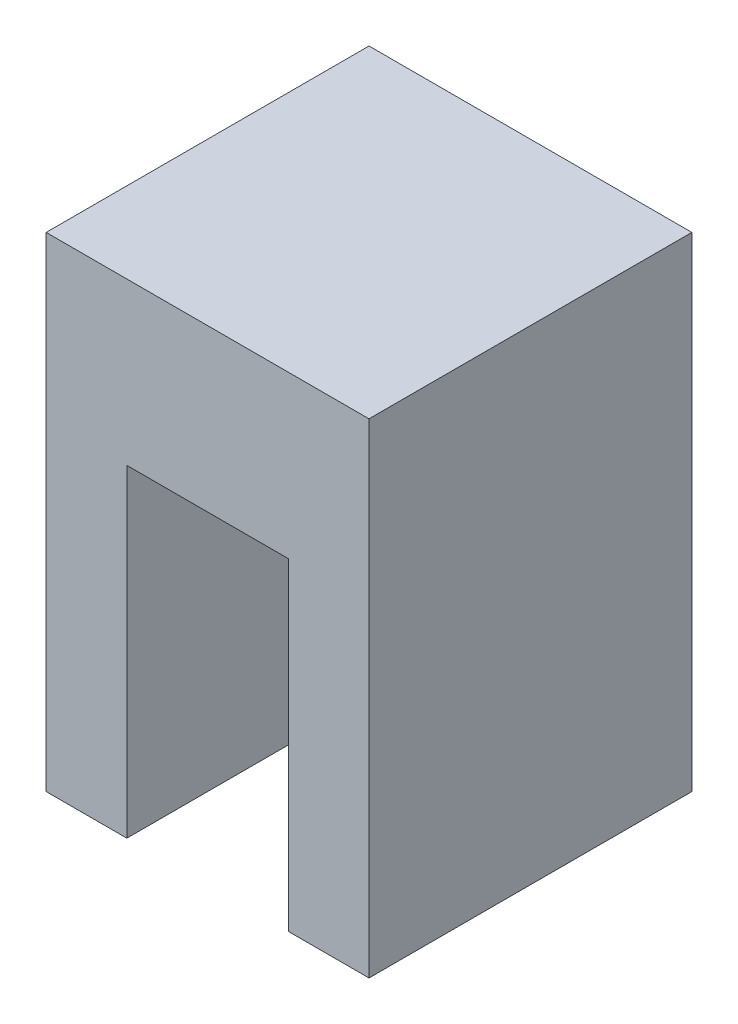
ISO-10303-21;
HEADER;
FILE_DESCRIPTION(('STEP AP214'),'2;1');
FILE_NAME('part.step','',(''),(''),'','','');
FILE_SCHEMA(('AUTOMOTIVE_DESIGN { 1 0 10303 214 1 1 1 1 }'));
ENDSEC;
DATA;
#1=APPLICATION_CONTEXT('core data for automotive mechanical design processes');
#2=APPLICATION_PROTOCOL_DEFINITION('international standard','automotive_design',2000,#1);
#3=PRODUCT_CONTEXT('',#1,'mechanical');
#4=PRODUCT('Part','Part','',(#3));
#5=PRODUCT_RELATED_PRODUCT_CATEGORY('part','',(#4));
#6=PRODUCT_DEFINITION_FORMATION('','',#4);
#7=PRODUCT_DEFINITION_CONTEXT('part definition',#1,'design');
#8=PRODUCT_DEFINITION('design','',#6,#7);
#9=PRODUCT_DEFINITION_SHAPE('','',#8);
#10=(LENGTH_UNIT() NAMED_UNIT(*) SI_UNIT(.MILLI.,.METRE.));
#11=(NAMED_UNIT(*) PLANE_ANGLE_UNIT() SI_UNIT($,.RADIAN.));
#12=(NAMED_UNIT(*) SI_UNIT($,.STERADIAN.) SOLID_ANGLE_UNIT());
#13=UNCERTAINTY_MEASURE_WITH_UNIT(LENGTH_MEASURE(1.E-05),#10,'distance_accuracy_value','');
#14=(GEOMETRIC_REPRESENTATION_CONTEXT(3) GLOBAL_UNCERTAINTY_ASSIGNED_CONTEXT((#13)) GLOBAL_UNIT_ASSIGNED_CONTEXT((#10,
#11,#12)) REPRESENTATION_CONTEXT('',''));
#15=CARTESIAN_POINT('',(0.,0.,0.));
#16=DIRECTION('',(0.,0.,1.));
#17=DIRECTION('',(1.,0.,0.));
#18=AXIS2_PLACEMENT_3D('',#15,#16,#17);
#19=CARTESIAN_POINT('',(5.,-15.8674300317965,20.));
#20=DIRECTION('',(0.,1.,0.));
#21=DIRECTION('',(0.,0.,1.));
#22=AXIS2_PLACEMENT_3D('',#19,#20,#21);
#23=PLANE('',#22);
#24=DIRECTION('',(1.,0.,0.));
#25=VECTOR('',#24,1.);
#26=CARTESIAN_POINT('',(5.,-15.8674300317965,0.));
#27=LINE('',#26,#25);
#28=CARTESIAN_POINT('',(0.,-15.8674300317965,0.));
#29=VERTEX_POINT('',#28);
#30=CARTESIAN_POINT('',(5.,-15.8674300317965,0.));
#31=VERTEX_POINT('',#30);
#32=EDGE_CURVE('E140',#29,#31,#27,.T.);
#33=ORIENTED_EDGE('',*,*,#32,.T.);
#34=DIRECTION('',(0.,0.,-1.));
#35=VECTOR('',#34,1.);
#36=CARTESIAN_POINT('',(5.,-15.8674300317965,20.));
#37=LINE('',#36,#35);
#38=CARTESIAN_POINT('',(5.,-15.8674300317965,20.));
#39=VERTEX_POINT('',#38);
#40=EDGE_CURVE('E11',#39,#31,#37,.T.);
#41=ORIENTED_EDGE('',*,*,#40,.F.);
#42=DIRECTION('',(1.,0.,0.));
#43=VECTOR('',#42,1.);
#44=CARTESIAN_POINT('',(5.,-15.8674300317965,20.));
#45=LINE('',#44,#43);
#46=CARTESIAN_POINT('',(0.,-15.8674300317965,20.));
#47=VERTEX_POINT('',#46);
#48=EDGE_CURVE('E162',#47,#39,#45,.T.);
#49=ORIENTED_EDGE('',*,*,#48,.F.);
#50=DIRECTION('',(0.,0.,-1.));
#51=VECTOR('',#50,1.);
#52=CARTESIAN_POINT('',(0.,-15.8674300317965,20.));
#53=LINE('',#52,#51);
#54=EDGE_CURVE('E136',#47,#29,#53,.T.);
#55=ORIENTED_EDGE('',*,*,#54,.T.);
#56=EDGE_LOOP('',(#33,#41,#49,#55));
#57=FACE_BOUND('',#56,.T.);
#58=ADVANCED_FACE('F39',(#57),#23,.F.);
#59=CARTESIAN_POINT('',(5.,4.13256996820354,20.));
#60=DIRECTION('',(-1.,0.,0.));
#61=DIRECTION('',(0.,-1.,0.));
#62=AXIS2_PLACEMENT_3D('',#59,#60,#61);
#63=PLANE('',#62);
#64=DIRECTION('',(0.,1.,0.));
#65=VECTOR('',#64,1.);
#66=CARTESIAN_POINT('',(5.,4.13256996820354,0.));
#67=LINE('',#66,#65);
#68=CARTESIAN_POINT('',(5.,4.13256996820354,0.));
#69=VERTEX_POINT('',#68);
#70=EDGE_CURVE('E144',#31,#69,#67,.T.);
#71=ORIENTED_EDGE('',*,*,#70,.T.);
#72=DIRECTION('',(0.,0.,-1.));
#73=VECTOR('',#72,1.);
#74=CARTESIAN_POINT('',(5.,4.13256996820354,20.));
#75=LINE('',#74,#73);
#76=CARTESIAN_POINT('',(5.,4.13256996820354,20.));
#77=VERTEX_POINT('',#76);
#78=EDGE_CURVE('E48',#77,#69,#75,.T.);
#79=ORIENTED_EDGE('',*,*,#78,.F.);
#80=DIRECTION('',(0.,1.,0.));
#81=VECTOR('',#80,1.);
#82=CARTESIAN_POINT('',(5.,4.13256996820354,20.));
#83=LINE('',#82,#81);
#84=EDGE_CURVE('E99',#39,#77,#83,.T.);
#85=ORIENTED_EDGE('',*,*,#84,.F.);
#86=ORIENTED_EDGE('',*,*,#40,.T.);
#87=EDGE_LOOP('',(#71,#79,#85,#86));
#88=FACE_BOUND('',#87,.T.);
#89=ADVANCED_FACE('F208',(#88),#63,.F.);
#90=CARTESIAN_POINT('',(5.,4.13256996820354,20.));
#91=DIRECTION('',(0.,1.,0.));
#92=DIRECTION('',(-1.,0.,0.));
#93=AXIS2_PLACEMENT_3D('',#90,#91,#92);
#94=PLANE('',#93);
#95=DIRECTION('',(1.,0.,0.));
#96=VECTOR('',#95,1.);
#97=CARTESIAN_POINT('',(5.,4.13256996820354,0.));
#98=LINE('',#97,#96);
#99=CARTESIAN_POINT('',(15.,4.13256996820354,0.));
#100=VERTEX_POINT('',#99);
#101=EDGE_CURVE('E147',#69,#100,#98,.T.);
#102=ORIENTED_EDGE('',*,*,#101,.T.);
#103=DIRECTION('',(0.,0.,-1.));
#104=VECTOR('',#103,1.);
#105=CARTESIAN_POINT('',(15.,4.13256996820354,20.));
#106=LINE('',#105,#104);
#107=CARTESIAN_POINT('',(15.,4.13256996820354,20.));
#108=VERTEX_POINT('',#107);
#109=EDGE_CURVE('E173',#108,#100,#106,.T.);
#110=ORIENTED_EDGE('',*,*,#109,.F.);
#111=DIRECTION('',(1.,0.,0.));
#112=VECTOR('',#111,1.);
#113=CARTESIAN_POINT('',(5.,4.13256996820354,20.));
#114=LINE('',#113,#112);
#115=EDGE_CURVE('E183',#77,#108,#114,.T.);
#116=ORIENTED_EDGE('',*,*,#115,.F.);
#117=ORIENTED_EDGE('',*,*,#78,.T.);
#118=EDGE_LOOP('',(#102,#110,#116,#117));
#119=FACE_BOUND('',#118,.T.);
#120=ADVANCED_FACE('F181',(#119),#94,.F.);
#121=CARTESIAN_POINT('',(15.,4.13256996820354,20.));
#122=DIRECTION('',(1.,0.,0.));
#123=DIRECTION('',(0.,1.,0.));
#124=AXIS2_PLACEMENT_3D('',#121,#122,#123);
#125=PLANE('',#124);
#126=DIRECTION('',(0.,-1.,0.));
#127=VECTOR('',#126,1.);
#128=CARTESIAN_POINT('',(15.,4.13256996820354,0.));
#129=LINE('',#128,#127);
#130=CARTESIAN_POINT('',(15.,-15.8674300317965,0.));
#131=VERTEX_POINT('',#130);
#132=EDGE_CURVE('E150',#100,#131,#129,.T.);
#133=ORIENTED_EDGE('',*,*,#132,.T.);
#134=DIRECTION('',(0.,0.,-1.));
#135=VECTOR('',#134,1.);
#136=CARTESIAN_POINT('',(15.,-15.8674300317965,20.));
#137=LINE('',#136,#135);
#138=CARTESIAN_POINT('',(15.,-15.8674300317965,20.));
#139=VERTEX_POINT('',#138);
#140=EDGE_CURVE('E169',#139,#131,#137,.T.);
#141=ORIENTED_EDGE('',*,*,#140,.F.);
#142=DIRECTION('',(0.,-1.,0.));
#143=VECTOR('',#142,1.);
#144=CARTESIAN_POINT('',(15.,4.13256996820354,20.));
#145=LINE('',#144,#143);
#146=EDGE_CURVE('E196',#108,#139,#145,.T.);
#147=ORIENTED_EDGE('',*,*,#146,.F.);
#148=ORIENTED_EDGE('',*,*,#109,.T.);
#149=EDGE_LOOP('',(#133,#141,#147,#148));
#150=FACE_BOUND('',#149,.T.);
#151=ADVANCED_FACE('F191',(#150),#125,.F.);
#152=CARTESIAN_POINT('',(20.,-15.8674300317965,20.));
#153=DIRECTION('',(0.,1.,0.));
#154=DIRECTION('',(0.,0.,1.));
#155=AXIS2_PLACEMENT_3D('',#152,#153,#154);
#156=PLANE('',#155);
#157=DIRECTION('',(1.,0.,0.));
#158=VECTOR('',#157,1.);
#159=CARTESIAN_POINT('',(20.,-15.8674300317965,0.));
#160=LINE('',#159,#158);
#161=CARTESIAN_POINT('',(20.,-15.8674300317965,0.));
#162=VERTEX_POINT('',#161);
#163=EDGE_CURVE('E153',#131,#162,#160,.T.);
#164=ORIENTED_EDGE('',*,*,#163,.T.);
#165=DIRECTION('',(0.,0.,-1.));
#166=VECTOR('',#165,1.);
#167=CARTESIAN_POINT('',(20.,-15.8674300317965,20.));
#168=LINE('',#167,#166);
#169=CARTESIAN_POINT('',(20.,-15.8674300317965,20.));
#170=VERTEX_POINT('',#169);
#171=EDGE_CURVE('E129',#170,#162,#168,.T.);
#172=ORIENTED_EDGE('',*,*,#171,.F.);
#173=DIRECTION('',(1.,0.,0.));
#174=VECTOR('',#173,1.);
#175=CARTESIAN_POINT('',(20.,-15.8674300317965,20.));
#176=LINE('',#175,#174);
#177=EDGE_CURVE('E118',#139,#170,#176,.T.);
#178=ORIENTED_EDGE('',*,*,#177,.F.);
#179=ORIENTED_EDGE('',*,*,#140,.T.);
#180=EDGE_LOOP('',(#164,#172,#178,#179));
#181=FACE_BOUND('',#180,.T.);
#182=ADVANCED_FACE('F194',(#181),#156,.F.);
#183=CARTESIAN_POINT('',(20.,14.1325699682035,20.));
#184=DIRECTION('',(-1.,0.,0.));
#185=DIRECTION('',(0.,-1.,0.));
#186=AXIS2_PLACEMENT_3D('',#183,#184,#185);
#187=PLANE('',#186);
#188=DIRECTION('',(0.,1.,0.));
#189=VECTOR('',#188,1.);
#190=CARTESIAN_POINT('',(20.,14.1325699682035,0.));
#191=LINE('',#190,#189);
#192=CARTESIAN_POINT('',(20.,14.1325699682035,0.));
#193=VERTEX_POINT('',#192);
#194=EDGE_CURVE('E127',#162,#193,#191,.T.);
#195=ORIENTED_EDGE('',*,*,#194,.T.);
#196=DIRECTION('',(0.,0.,-1.));
#197=VECTOR('',#196,1.);
#198=CARTESIAN_POINT('',(20.,14.1325699682035,20.));
#199=LINE('',#198,#197);
#200=CARTESIAN_POINT('',(20.,14.1325699682035,20.));
#201=VERTEX_POINT('',#200);
#202=EDGE_CURVE('E124',#201,#193,#199,.T.);
#203=ORIENTED_EDGE('',*,*,#202,.F.);
#204=DIRECTION('',(0.,1.,0.));
#205=VECTOR('',#204,1.);
#206=CARTESIAN_POINT('',(20.,14.1325699682035,20.));
#207=LINE('',#206,#205);
#208=EDGE_CURVE('E112',#170,#201,#207,.T.);
#209=ORIENTED_EDGE('',*,*,#208,.F.);
#210=ORIENTED_EDGE('',*,*,#171,.T.);
#211=EDGE_LOOP('',(#195,#203,#209,#210));
#212=FACE_BOUND('',#211,.T.);
#213=ADVANCED_FACE('F125',(#212),#187,.F.);
#214=CARTESIAN_POINT('',(0.,14.1325699682035,20.));
#215=DIRECTION('',(0.,-1.,0.));
#216=DIRECTION('',(0.,0.,-1.));
#217=AXIS2_PLACEMENT_3D('',#214,#215,#216);
#218=PLANE('',#217);
#219=DIRECTION('',(-1.,0.,0.));
#220=VECTOR('',#219,1.);
#221=CARTESIAN_POINT('',(0.,14.1325699682035,0.));
#222=LINE('',#221,#220);
#223=CARTESIAN_POINT('',(0.,14.1325699682035,0.));
#224=VERTEX_POINT('',#223);
#225=EDGE_CURVE('E85',#193,#224,#222,.T.);
#226=ORIENTED_EDGE('',*,*,#225,.T.);
#227=DIRECTION('',(0.,0.,-1.));
#228=VECTOR('',#227,1.);
#229=CARTESIAN_POINT('',(0.,14.1325699682035,20.));
#230=LINE('',#229,#228);
#231=CARTESIAN_POINT('',(0.,14.1325699682035,20.));
#232=VERTEX_POINT('',#231);
#233=EDGE_CURVE('E130',#232,#224,#230,.T.);
#234=ORIENTED_EDGE('',*,*,#233,.F.);
#235=DIRECTION('',(-1.,0.,0.));
#236=VECTOR('',#235,1.);
#237=CARTESIAN_POINT('',(0.,14.1325699682035,20.));
#238=LINE('',#237,#236);
#239=EDGE_CURVE('E116',#201,#232,#238,.T.);
#240=ORIENTED_EDGE('',*,*,#239,.F.);
#241=ORIENTED_EDGE('',*,*,#202,.T.);
#242=EDGE_LOOP('',(#226,#234,#240,#241));
#243=FACE_BOUND('',#242,.T.);
#244=ADVANCED_FACE('F132',(#243),#218,.F.);
#245=CARTESIAN_POINT('',(0.,-15.8674300317965,20.));
#246=DIRECTION('',(1.,0.,0.));
#247=DIRECTION('',(0.,0.,-1.));
#248=AXIS2_PLACEMENT_3D('',#245,#246,#247);
#249=PLANE('',#248);
#250=DIRECTION('',(0.,-1.,0.));
#251=VECTOR('',#250,1.);
#252=CARTESIAN_POINT('',(0.,-15.8674300317965,0.));
#253=LINE('',#252,#251);
#254=EDGE_CURVE('E91',#224,#29,#253,.T.);
#255=ORIENTED_EDGE('',*,*,#254,.T.);
#256=ORIENTED_EDGE('',*,*,#54,.F.);
#257=DIRECTION('',(0.,-1.,0.));
#258=VECTOR('',#257,1.);
#259=CARTESIAN_POINT('',(0.,-15.8674300317965,20.));
#260=LINE('',#259,#258);
#261=EDGE_CURVE('E56',#232,#47,#260,.T.);
#262=ORIENTED_EDGE('',*,*,#261,.F.);
#263=ORIENTED_EDGE('',*,*,#233,.T.);
#264=EDGE_LOOP('',(#255,#256,#262,#263));
#265=FACE_BOUND('',#264,.T.);
#266=ADVANCED_FACE('F224',(#265),#249,.F.);
#267=CARTESIAN_POINT('',(0.,0.,20.));
#268=DIRECTION('',(0.,0.,-1.));
#269=DIRECTION('',(-1.,0.,0.));
#270=AXIS2_PLACEMENT_3D('',#267,#268,#269);
#271=PLANE('',#270);
#272=ORIENTED_EDGE('',*,*,#48,.T.);
#273=ORIENTED_EDGE('',*,*,#84,.T.);
#274=ORIENTED_EDGE('',*,*,#115,.T.);
#275=ORIENTED_EDGE('',*,*,#146,.T.);
#276=ORIENTED_EDGE('',*,*,#177,.T.);
#277=ORIENTED_EDGE('',*,*,#208,.T.);
#278=ORIENTED_EDGE('',*,*,#239,.T.);
#279=ORIENTED_EDGE('',*,*,#261,.T.);
#280=EDGE_LOOP('',(#272,#273,#274,#275,#276,#277,#278,#279));
#281=FACE_BOUND('',#280,.T.);
#282=ADVANCED_FACE('F114',(#281),#271,.F.);
#283=CARTESIAN_POINT('',(0.,0.,0.));
#284=DIRECTION('',(0.,0.,-1.));
#285=DIRECTION('',(-1.,0.,0.));
#286=AXIS2_PLACEMENT_3D('',#283,#284,#285);
#287=PLANE('',#286);
#288=ORIENTED_EDGE('',*,*,#32,.F.);
#289=ORIENTED_EDGE('',*,*,#254,.F.);
#290=ORIENTED_EDGE('',*,*,#225,.F.);
#291=ORIENTED_EDGE('',*,*,#194,.F.);
#292=ORIENTED_EDGE('',*,*,#163,.F.);
#293=ORIENTED_EDGE('',*,*,#132,.F.);
#294=ORIENTED_EDGE('',*,*,#101,.F.);
#295=ORIENTED_EDGE('',*,*,#70,.F.);
#296=EDGE_LOOP('',(#288,#289,#290,#291,#292,#293,#294,#295));
#297=FACE_BOUND('',#296,.T.);
#298=ADVANCED_FACE('F187',(#297),#287,.T.);
#299=CLOSED_SHELL('',(#58,#89,#120,#151,#182,#213,#244,#266,#282,#298));
#300=MANIFOLD_SOLID_BREP('B2',#299);
#301=ADVANCED_BREP_SHAPE_REPRESENTATION('',(#18,#300),#14);
#302=SHAPE_DEFINITION_REPRESENTATION(#9,#301);
ENDSEC;
END-ISO-10303-21;
